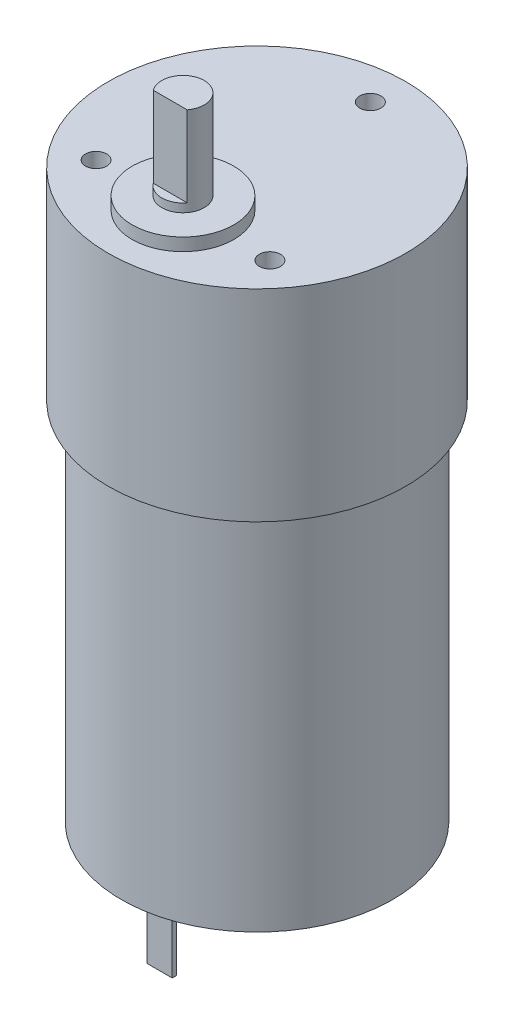
ISO-10303-21;
HEADER;
FILE_DESCRIPTION(('STEP AP214'),'2;1');
FILE_NAME('part.step','',(''),(''),'','','');
FILE_SCHEMA(('AUTOMOTIVE_DESIGN { 1 0 10303 214 1 1 1 1 }'));
ENDSEC;
DATA;
#1=APPLICATION_CONTEXT('core data for automotive mechanical design processes');
#2=APPLICATION_PROTOCOL_DEFINITION('international standard','automotive_design',2000,#1);
#3=PRODUCT_CONTEXT('',#1,'mechanical');
#4=PRODUCT('Part','Part','',(#3));
#5=PRODUCT_RELATED_PRODUCT_CATEGORY('part','',(#4));
#6=PRODUCT_DEFINITION_FORMATION('','',#4);
#7=PRODUCT_DEFINITION_CONTEXT('part definition',#1,'design');
#8=PRODUCT_DEFINITION('design','',#6,#7);
#9=PRODUCT_DEFINITION_SHAPE('','',#8);
#10=(LENGTH_UNIT() NAMED_UNIT(*) SI_UNIT(.MILLI.,.METRE.));
#11=(NAMED_UNIT(*) PLANE_ANGLE_UNIT() SI_UNIT($,.RADIAN.));
#12=(NAMED_UNIT(*) SI_UNIT($,.STERADIAN.) SOLID_ANGLE_UNIT());
#13=UNCERTAINTY_MEASURE_WITH_UNIT(LENGTH_MEASURE(1.E-05),#10,'distance_accuracy_value','');
#14=(GEOMETRIC_REPRESENTATION_CONTEXT(3) GLOBAL_UNCERTAINTY_ASSIGNED_CONTEXT((#13)) GLOBAL_UNIT_ASSIGNED_CONTEXT((#10,
#11,#12)) REPRESENTATION_CONTEXT('',''));
#15=CARTESIAN_POINT('',(0.,0.,0.));
#16=DIRECTION('',(0.,0.,1.));
#17=DIRECTION('',(1.,0.,0.));
#18=AXIS2_PLACEMENT_3D('',#15,#16,#17);
#19=CARTESIAN_POINT('',(16.,0.500000000000001,0.));
#20=DIRECTION('',(0.,-1.,0.));
#21=DIRECTION('',(0.,0.,-1.));
#22=AXIS2_PLACEMENT_3D('',#19,#20,#21);
#23=PLANE('',#22);
#24=DIRECTION('',(1.,0.,0.));
#25=VECTOR('',#24,1.);
#26=CARTESIAN_POINT('',(-1.5,0.500000000000001,11.));
#27=LINE('',#26,#25);
#28=CARTESIAN_POINT('',(-1.5,0.500000000000001,11.));
#29=VERTEX_POINT('',#28);
#30=CARTESIAN_POINT('',(1.5,0.500000000000001,11.));
#31=VERTEX_POINT('',#30);
#32=EDGE_CURVE('E150',#29,#31,#27,.T.);
#33=ORIENTED_EDGE('',*,*,#32,.F.);
#34=DIRECTION('',(0.,0.,-1.));
#35=VECTOR('',#34,1.);
#36=CARTESIAN_POINT('',(-1.5,0.500000000000001,11.5));
#37=LINE('',#36,#35);
#38=CARTESIAN_POINT('',(-1.5,0.500000000000001,11.5));
#39=VERTEX_POINT('',#38);
#40=EDGE_CURVE('E147',#39,#29,#37,.T.);
#41=ORIENTED_EDGE('',*,*,#40,.F.);
#42=DIRECTION('',(-1.,0.,0.));
#43=VECTOR('',#42,1.);
#44=CARTESIAN_POINT('',(-1.5,0.500000000000001,11.5));
#45=LINE('',#44,#43);
#46=CARTESIAN_POINT('',(1.5,0.500000000000001,11.5));
#47=VERTEX_POINT('',#46);
#48=EDGE_CURVE('E159',#47,#39,#45,.T.);
#49=ORIENTED_EDGE('',*,*,#48,.F.);
#50=DIRECTION('',(0.,0.,1.));
#51=VECTOR('',#50,1.);
#52=CARTESIAN_POINT('',(1.5,0.500000000000001,11.5));
#53=LINE('',#52,#51);
#54=EDGE_CURVE('E167',#31,#47,#53,.T.);
#55=ORIENTED_EDGE('',*,*,#54,.F.);
#56=EDGE_LOOP('',(#33,#41,#49,#55));
#57=FACE_BOUND('',#56,.T.);
#58=CARTESIAN_POINT('',(0.,0.500000000000001,0.));
#59=DIRECTION('',(0.,-1.,0.));
#60=DIRECTION('',(0.,0.,-1.));
#61=AXIS2_PLACEMENT_3D('',#58,#59,#60);
#62=CIRCLE('',#61,16.);
#63=CARTESIAN_POINT('',(0.,0.500000000000001,-16.));
#64=VERTEX_POINT('',#63);
#65=EDGE_CURVE('E227',#64,#64,#62,.T.);
#66=ORIENTED_EDGE('',*,*,#65,.T.);
#67=EDGE_LOOP('',(#66));
#68=FACE_BOUND('',#67,.T.);
#69=CARTESIAN_POINT('',(0.,0.5,0.));
#70=DIRECTION('',(0.,-1.,0.));
#71=DIRECTION('',(0.,0.,-1.));
#72=AXIS2_PLACEMENT_3D('',#69,#70,#71);
#73=CIRCLE('',#72,4.);
#74=CARTESIAN_POINT('',(0.,0.5,-4.));
#75=VERTEX_POINT('',#74);
#76=EDGE_CURVE('E230',#75,#75,#73,.T.);
#77=ORIENTED_EDGE('',*,*,#76,.F.);
#78=EDGE_LOOP('',(#77));
#79=FACE_BOUND('',#78,.T.);
#80=DIRECTION('',(-1.,0.,0.));
#81=VECTOR('',#80,1.);
#82=CARTESIAN_POINT('',(1.5,0.500000000000001,-11.));
#83=LINE('',#82,#81);
#84=CARTESIAN_POINT('',(1.5,0.500000000000001,-11.));
#85=VERTEX_POINT('',#84);
#86=CARTESIAN_POINT('',(-1.5,0.500000000000001,-11.));
#87=VERTEX_POINT('',#86);
#88=EDGE_CURVE('E530',#85,#87,#83,.T.);
#89=ORIENTED_EDGE('',*,*,#88,.F.);
#90=DIRECTION('',(0.,0.,1.));
#91=VECTOR('',#90,1.);
#92=CARTESIAN_POINT('',(1.5,0.500000000000001,-11.5));
#93=LINE('',#92,#91);
#94=CARTESIAN_POINT('',(1.5,0.500000000000001,-11.5));
#95=VERTEX_POINT('',#94);
#96=EDGE_CURVE('E145',#95,#85,#93,.T.);
#97=ORIENTED_EDGE('',*,*,#96,.F.);
#98=DIRECTION('',(1.,0.,0.));
#99=VECTOR('',#98,1.);
#100=CARTESIAN_POINT('',(1.5,0.500000000000001,-11.5));
#101=LINE('',#100,#99);
#102=CARTESIAN_POINT('',(-1.5,0.500000000000001,-11.5));
#103=VERTEX_POINT('',#102);
#104=EDGE_CURVE('E141',#103,#95,#101,.T.);
#105=ORIENTED_EDGE('',*,*,#104,.F.);
#106=DIRECTION('',(0.,0.,-1.));
#107=VECTOR('',#106,1.);
#108=CARTESIAN_POINT('',(-1.5,0.500000000000001,-11.5));
#109=LINE('',#108,#107);
#110=EDGE_CURVE('E527',#87,#103,#109,.T.);
#111=ORIENTED_EDGE('',*,*,#110,.F.);
#112=EDGE_LOOP('',(#89,#97,#105,#111));
#113=FACE_BOUND('',#112,.T.);
#114=ADVANCED_FACE('F35',(#57,#68,#79,#113),#23,.T.);
#115=CARTESIAN_POINT('',(0.,68.8,8.73));
#116=DIRECTION('',(0.,1.,0.));
#117=DIRECTION('',(0.,0.,1.));
#118=AXIS2_PLACEMENT_3D('',#115,#116,#117);
#119=PLANE('',#118);
#120=CARTESIAN_POINT('',(0.,68.8,8.73));
#121=DIRECTION('',(0.,1.,0.));
#122=DIRECTION('',(0.,0.,1.));
#123=AXIS2_PLACEMENT_3D('',#120,#121,#122);
#124=CIRCLE('',#123,6.);
#125=CARTESIAN_POINT('',(0.,68.8,14.73));
#126=VERTEX_POINT('',#125);
#127=EDGE_CURVE('E213',#126,#126,#124,.T.);
#128=ORIENTED_EDGE('',*,*,#127,.T.);
#129=EDGE_LOOP('',(#128));
#130=FACE_BOUND('',#129,.T.);
#131=CARTESIAN_POINT('',(0.,68.8,8.73));
#132=DIRECTION('',(0.,1.,0.));
#133=DIRECTION('',(0.,0.,1.));
#134=AXIS2_PLACEMENT_3D('',#131,#132,#133);
#135=CIRCLE('',#134,2.5);
#136=CARTESIAN_POINT('',(0.,68.8,11.23));
#137=VERTEX_POINT('',#136);
#138=EDGE_CURVE('E206',#137,#137,#135,.T.);
#139=ORIENTED_EDGE('',*,*,#138,.F.);
#140=EDGE_LOOP('',(#139));
#141=FACE_BOUND('',#140,.T.);
#142=ADVANCED_FACE('F250',(#130,#141),#119,.T.);
#143=CARTESIAN_POINT('',(17.55,67.3,0.));
#144=DIRECTION('',(0.,1.,0.));
#145=DIRECTION('',(0.,0.,1.));
#146=AXIS2_PLACEMENT_3D('',#143,#144,#145);
#147=PLANE('',#146);
#148=CARTESIAN_POINT('',(0.,67.3,-13.37));
#149=DIRECTION('',(0.,1.,0.));
#150=DIRECTION('',(0.,0.,1.));
#151=AXIS2_PLACEMENT_3D('',#148,#149,#150);
#152=CIRCLE('',#151,1.25);
#153=CARTESIAN_POINT('',(0.,67.3,-12.12));
#154=VERTEX_POINT('',#153);
#155=EDGE_CURVE('E187',#154,#154,#152,.T.);
#156=ORIENTED_EDGE('',*,*,#155,.F.);
#157=EDGE_LOOP('',(#156));
#158=FACE_BOUND('',#157,.T.);
#159=CARTESIAN_POINT('',(10.25,67.3,8.73));
#160=DIRECTION('',(0.,1.,0.));
#161=DIRECTION('',(0.,0.,1.));
#162=AXIS2_PLACEMENT_3D('',#159,#160,#161);
#163=CIRCLE('',#162,1.25);
#164=CARTESIAN_POINT('',(10.25,67.3,9.98));
#165=VERTEX_POINT('',#164);
#166=EDGE_CURVE('E194',#165,#165,#163,.T.);
#167=ORIENTED_EDGE('',*,*,#166,.F.);
#168=EDGE_LOOP('',(#167));
#169=FACE_BOUND('',#168,.T.);
#170=CARTESIAN_POINT('',(-10.25,67.3,8.73));
#171=DIRECTION('',(0.,1.,0.));
#172=DIRECTION('',(0.,0.,1.));
#173=AXIS2_PLACEMENT_3D('',#170,#171,#172);
#174=CIRCLE('',#173,1.25);
#175=CARTESIAN_POINT('',(-10.25,67.3,9.98));
#176=VERTEX_POINT('',#175);
#177=EDGE_CURVE('E200',#176,#176,#174,.T.);
#178=ORIENTED_EDGE('',*,*,#177,.F.);
#179=EDGE_LOOP('',(#178));
#180=FACE_BOUND('',#179,.T.);
#181=CARTESIAN_POINT('',(0.,67.3,0.));
#182=DIRECTION('',(0.,-1.,0.));
#183=DIRECTION('',(0.,0.,-1.));
#184=AXIS2_PLACEMENT_3D('',#181,#182,#183);
#185=CIRCLE('',#184,17.55);
#186=CARTESIAN_POINT('',(0.,67.3,-17.55));
#187=VERTEX_POINT('',#186);
#188=EDGE_CURVE('E216',#187,#187,#185,.T.);
#189=ORIENTED_EDGE('',*,*,#188,.F.);
#190=EDGE_LOOP('',(#189));
#191=FACE_BOUND('',#190,.T.);
#192=CARTESIAN_POINT('',(0.,67.3,8.73));
#193=DIRECTION('',(0.,1.,0.));
#194=DIRECTION('',(0.,0.,1.));
#195=AXIS2_PLACEMENT_3D('',#192,#193,#194);
#196=CIRCLE('',#195,6.);
#197=CARTESIAN_POINT('',(0.,67.3,14.73));
#198=VERTEX_POINT('',#197);
#199=EDGE_CURVE('E210',#198,#198,#196,.T.);
#200=ORIENTED_EDGE('',*,*,#199,.F.);
#201=EDGE_LOOP('',(#200));
#202=FACE_BOUND('',#201,.T.);
#203=ADVANCED_FACE('F247',(#158,#169,#180,#191,#202),#147,.T.);
#204=CARTESIAN_POINT('',(4.,0.,0.));
#205=DIRECTION('',(0.,-1.,0.));
#206=DIRECTION('',(0.,0.,-1.));
#207=AXIS2_PLACEMENT_3D('',#204,#205,#206);
#208=PLANE('',#207);
#209=CARTESIAN_POINT('',(0.,0.,0.));
#210=DIRECTION('',(0.,-1.,0.));
#211=DIRECTION('',(0.,0.,-1.));
#212=AXIS2_PLACEMENT_3D('',#209,#210,#211);
#213=CIRCLE('',#212,4.);
#214=CARTESIAN_POINT('',(0.,0.,-4.));
#215=VERTEX_POINT('',#214);
#216=EDGE_CURVE('E43',#215,#215,#213,.T.);
#217=ORIENTED_EDGE('',*,*,#216,.T.);
#218=EDGE_LOOP('',(#217));
#219=FACE_BOUND('',#218,.T.);
#220=ADVANCED_FACE('F37',(#219),#208,.T.);
#221=CARTESIAN_POINT('',(0.,0.,0.));
#222=DIRECTION('',(0.,-1.,0.));
#223=DIRECTION('',(0.,0.,-1.));
#224=AXIS2_PLACEMENT_3D('',#221,#222,#223);
#225=CYLINDRICAL_SURFACE('',#224,4.);
#226=ORIENTED_EDGE('',*,*,#76,.T.);
#227=EDGE_LOOP('',(#226));
#228=FACE_BOUND('',#227,.T.);
#229=ORIENTED_EDGE('',*,*,#216,.F.);
#230=EDGE_LOOP('',(#229));
#231=FACE_BOUND('',#230,.T.);
#232=ADVANCED_FACE('F236',(#228,#231),#225,.T.);
#233=CARTESIAN_POINT('',(0.,0.,0.));
#234=DIRECTION('',(0.,-1.,0.));
#235=DIRECTION('',(0.,0.,-1.));
#236=AXIS2_PLACEMENT_3D('',#233,#234,#235);
#237=CYLINDRICAL_SURFACE('',#236,16.);
#238=CARTESIAN_POINT('',(0.,43.5,0.));
#239=DIRECTION('',(0.,-1.,0.));
#240=DIRECTION('',(0.,0.,-1.));
#241=AXIS2_PLACEMENT_3D('',#238,#239,#240);
#242=CIRCLE('',#241,16.);
#243=CARTESIAN_POINT('',(0.,43.5,-16.));
#244=VERTEX_POINT('',#243);
#245=EDGE_CURVE('E224',#244,#244,#242,.T.);
#246=ORIENTED_EDGE('',*,*,#245,.T.);
#247=EDGE_LOOP('',(#246));
#248=FACE_BOUND('',#247,.T.);
#249=ORIENTED_EDGE('',*,*,#65,.F.);
#250=EDGE_LOOP('',(#249));
#251=FACE_BOUND('',#250,.T.);
#252=ADVANCED_FACE('F238',(#248,#251),#237,.T.);
#253=CARTESIAN_POINT('',(16.,43.5,0.));
#254=DIRECTION('',(0.,-1.,0.));
#255=DIRECTION('',(0.,0.,-1.));
#256=AXIS2_PLACEMENT_3D('',#253,#254,#255);
#257=PLANE('',#256);
#258=CARTESIAN_POINT('',(0.,43.5,0.));
#259=DIRECTION('',(0.,-1.,0.));
#260=DIRECTION('',(0.,0.,-1.));
#261=AXIS2_PLACEMENT_3D('',#258,#259,#260);
#262=CIRCLE('',#261,17.55);
#263=CARTESIAN_POINT('',(0.,43.5,-17.55));
#264=VERTEX_POINT('',#263);
#265=EDGE_CURVE('E221',#264,#264,#262,.T.);
#266=ORIENTED_EDGE('',*,*,#265,.T.);
#267=EDGE_LOOP('',(#266));
#268=FACE_BOUND('',#267,.T.);
#269=ORIENTED_EDGE('',*,*,#245,.F.);
#270=EDGE_LOOP('',(#269));
#271=FACE_BOUND('',#270,.T.);
#272=ADVANCED_FACE('F244',(#268,#271),#257,.T.);
#273=CARTESIAN_POINT('',(0.,0.,0.));
#274=DIRECTION('',(0.,-1.,0.));
#275=DIRECTION('',(0.,0.,-1.));
#276=AXIS2_PLACEMENT_3D('',#273,#274,#275);
#277=CYLINDRICAL_SURFACE('',#276,17.55);
#278=ORIENTED_EDGE('',*,*,#188,.T.);
#279=EDGE_LOOP('',(#278));
#280=FACE_BOUND('',#279,.T.);
#281=ORIENTED_EDGE('',*,*,#265,.F.);
#282=EDGE_LOOP('',(#281));
#283=FACE_BOUND('',#282,.T.);
#284=ADVANCED_FACE('F262',(#280,#283),#277,.T.);
#285=CARTESIAN_POINT('',(0.,68.8,8.73));
#286=DIRECTION('',(0.,-1.,0.));
#287=DIRECTION('',(0.,0.,-1.));
#288=AXIS2_PLACEMENT_3D('',#285,#286,#287);
#289=CYLINDRICAL_SURFACE('',#288,6.);
#290=ORIENTED_EDGE('',*,*,#127,.F.);
#291=EDGE_LOOP('',(#290));
#292=FACE_BOUND('',#291,.T.);
#293=ORIENTED_EDGE('',*,*,#199,.T.);
#294=EDGE_LOOP('',(#293));
#295=FACE_BOUND('',#294,.T.);
#296=ADVANCED_FACE('F266',(#292,#295),#289,.T.);
#297=CARTESIAN_POINT('',(0.,79.3,8.73));
#298=DIRECTION('',(0.,-1.,0.));
#299=DIRECTION('',(0.,0.,-1.));
#300=AXIS2_PLACEMENT_3D('',#297,#298,#299);
#301=CYLINDRICAL_SURFACE('',#300,2.5);
#302=CARTESIAN_POINT('',(0.,69.8,8.73));
#303=DIRECTION('',(0.,-1.,0.));
#304=DIRECTION('',(0.,0.,-1.));
#305=AXIS2_PLACEMENT_3D('',#302,#303,#304);
#306=CIRCLE('',#305,2.5);
#307=CARTESIAN_POINT('',(2.,69.8,10.23));
#308=VERTEX_POINT('',#307);
#309=CARTESIAN_POINT('',(-2.,69.8,10.23));
#310=VERTEX_POINT('',#309);
#311=EDGE_CURVE('E11',#308,#310,#306,.T.);
#312=ORIENTED_EDGE('',*,*,#311,.T.);
#313=DIRECTION('',(0.,1.,0.));
#314=VECTOR('',#313,1.);
#315=CARTESIAN_POINT('',(-2.,69.8,10.23));
#316=LINE('',#315,#314);
#317=CARTESIAN_POINT('',(-2.,79.3,10.23));
#318=VERTEX_POINT('',#317);
#319=EDGE_CURVE('E184',#310,#318,#316,.T.);
#320=ORIENTED_EDGE('',*,*,#319,.T.);
#321=CARTESIAN_POINT('',(0.,79.3,8.73));
#322=DIRECTION('',(0.,1.,0.));
#323=DIRECTION('',(0.,0.,1.));
#324=AXIS2_PLACEMENT_3D('',#321,#322,#323);
#325=CIRCLE('',#324,2.5);
#326=CARTESIAN_POINT('',(2.,79.3,10.23));
#327=VERTEX_POINT('',#326);
#328=EDGE_CURVE('E207',#327,#318,#325,.T.);
#329=ORIENTED_EDGE('',*,*,#328,.F.);
#330=DIRECTION('',(0.,1.,0.));
#331=VECTOR('',#330,1.);
#332=CARTESIAN_POINT('',(2.,69.8,10.23));
#333=LINE('',#332,#331);
#334=EDGE_CURVE('E182',#308,#327,#333,.T.);
#335=ORIENTED_EDGE('',*,*,#334,.F.);
#336=EDGE_LOOP('',(#312,#320,#329,#335));
#337=FACE_BOUND('',#336,.T.);
#338=ORIENTED_EDGE('',*,*,#138,.T.);
#339=EDGE_LOOP('',(#338));
#340=FACE_BOUND('',#339,.T.);
#341=ADVANCED_FACE('F272',(#337,#340),#301,.T.);
#342=CARTESIAN_POINT('',(0.,79.3,8.73));
#343=DIRECTION('',(0.,1.,0.));
#344=DIRECTION('',(0.,0.,1.));
#345=AXIS2_PLACEMENT_3D('',#342,#343,#344);
#346=PLANE('',#345);
#347=DIRECTION('',(-1.,0.,0.));
#348=VECTOR('',#347,1.);
#349=CARTESIAN_POINT('',(-2.,79.3,10.23));
#350=LINE('',#349,#348);
#351=EDGE_CURVE('E178',#327,#318,#350,.T.);
#352=ORIENTED_EDGE('',*,*,#351,.F.);
#353=ORIENTED_EDGE('',*,*,#328,.T.);
#354=EDGE_LOOP('',(#352,#353));
#355=FACE_BOUND('',#354,.T.);
#356=ADVANCED_FACE('F277',(#355),#346,.T.);
#357=CARTESIAN_POINT('',(-10.25,62.8,8.73));
#358=DIRECTION('',(0.,1.,0.));
#359=DIRECTION('',(0.,0.,1.));
#360=AXIS2_PLACEMENT_3D('',#357,#358,#359);
#361=CONICAL_SURFACE('',#360,1.25,1.02974425867666);
#362=CARTESIAN_POINT('',(-10.25,62.0489242262156,8.73));
#363=VERTEX_POINT('',#362);
#364=VERTEX_LOOP('',#363);
#365=FACE_BOUND('',#364,.T.);
#366=CARTESIAN_POINT('',(-10.25,62.8,8.73));
#367=DIRECTION('',(0.,1.,0.));
#368=DIRECTION('',(0.,0.,1.));
#369=AXIS2_PLACEMENT_3D('',#366,#367,#368);
#370=CIRCLE('',#369,1.25);
#371=CARTESIAN_POINT('',(-10.25,62.8,9.98));
#372=VERTEX_POINT('',#371);
#373=EDGE_CURVE('E203',#372,#372,#370,.T.);
#374=ORIENTED_EDGE('',*,*,#373,.T.);
#375=EDGE_LOOP('',(#374));
#376=FACE_BOUND('',#375,.T.);
#377=ADVANCED_FACE('F281',(#365,#376),#361,.F.);
#378=CARTESIAN_POINT('',(-10.25,67.3,8.73));
#379=DIRECTION('',(0.,1.,0.));
#380=DIRECTION('',(0.,0.,1.));
#381=AXIS2_PLACEMENT_3D('',#378,#379,#380);
#382=CYLINDRICAL_SURFACE('',#381,1.25);
#383=ORIENTED_EDGE('',*,*,#373,.F.);
#384=EDGE_LOOP('',(#383));
#385=FACE_BOUND('',#384,.T.);
#386=ORIENTED_EDGE('',*,*,#177,.T.);
#387=EDGE_LOOP('',(#386));
#388=FACE_BOUND('',#387,.T.);
#389=ADVANCED_FACE('F285',(#385,#388),#382,.F.);
#390=CARTESIAN_POINT('',(10.25,62.8,8.73));
#391=DIRECTION('',(0.,1.,0.));
#392=DIRECTION('',(0.,0.,1.));
#393=AXIS2_PLACEMENT_3D('',#390,#391,#392);
#394=CONICAL_SURFACE('',#393,1.25,1.02974425867666);
#395=CARTESIAN_POINT('',(10.25,62.0489242262156,8.73));
#396=VERTEX_POINT('',#395);
#397=VERTEX_LOOP('',#396);
#398=FACE_BOUND('',#397,.T.);
#399=CARTESIAN_POINT('',(10.25,62.8,8.73));
#400=DIRECTION('',(0.,1.,0.));
#401=DIRECTION('',(0.,0.,1.));
#402=AXIS2_PLACEMENT_3D('',#399,#400,#401);
#403=CIRCLE('',#402,1.25);
#404=CARTESIAN_POINT('',(10.25,62.8,9.98));
#405=VERTEX_POINT('',#404);
#406=EDGE_CURVE('E197',#405,#405,#403,.T.);
#407=ORIENTED_EDGE('',*,*,#406,.T.);
#408=EDGE_LOOP('',(#407));
#409=FACE_BOUND('',#408,.T.);
#410=ADVANCED_FACE('F289',(#398,#409),#394,.F.);
#411=CARTESIAN_POINT('',(10.25,67.3,8.73));
#412=DIRECTION('',(0.,1.,0.));
#413=DIRECTION('',(0.,0.,1.));
#414=AXIS2_PLACEMENT_3D('',#411,#412,#413);
#415=CYLINDRICAL_SURFACE('',#414,1.25);
#416=ORIENTED_EDGE('',*,*,#406,.F.);
#417=EDGE_LOOP('',(#416));
#418=FACE_BOUND('',#417,.T.);
#419=ORIENTED_EDGE('',*,*,#166,.T.);
#420=EDGE_LOOP('',(#419));
#421=FACE_BOUND('',#420,.T.);
#422=ADVANCED_FACE('F293',(#418,#421),#415,.F.);
#423=CARTESIAN_POINT('',(0.,62.8,-13.37));
#424=DIRECTION('',(0.,1.,0.));
#425=DIRECTION('',(0.,0.,1.));
#426=AXIS2_PLACEMENT_3D('',#423,#424,#425);
#427=CONICAL_SURFACE('',#426,1.25,1.02974425867666);
#428=CARTESIAN_POINT('',(0.,62.0489242262156,-13.37));
#429=VERTEX_POINT('',#428);
#430=VERTEX_LOOP('',#429);
#431=FACE_BOUND('',#430,.T.);
#432=CARTESIAN_POINT('',(0.,62.8,-13.37));
#433=DIRECTION('',(0.,1.,0.));
#434=DIRECTION('',(0.,0.,1.));
#435=AXIS2_PLACEMENT_3D('',#432,#433,#434);
#436=CIRCLE('',#435,1.25);
#437=CARTESIAN_POINT('',(0.,62.8,-12.12));
#438=VERTEX_POINT('',#437);
#439=EDGE_CURVE('E191',#438,#438,#436,.T.);
#440=ORIENTED_EDGE('',*,*,#439,.T.);
#441=EDGE_LOOP('',(#440));
#442=FACE_BOUND('',#441,.T.);
#443=ADVANCED_FACE('F297',(#431,#442),#427,.F.);
#444=CARTESIAN_POINT('',(0.,67.3,-13.37));
#445=DIRECTION('',(0.,1.,0.));
#446=DIRECTION('',(0.,0.,1.));
#447=AXIS2_PLACEMENT_3D('',#444,#445,#446);
#448=CYLINDRICAL_SURFACE('',#447,1.25);
#449=ORIENTED_EDGE('',*,*,#439,.F.);
#450=EDGE_LOOP('',(#449));
#451=FACE_BOUND('',#450,.T.);
#452=ORIENTED_EDGE('',*,*,#155,.T.);
#453=EDGE_LOOP('',(#452));
#454=FACE_BOUND('',#453,.T.);
#455=ADVANCED_FACE('F301',(#451,#454),#448,.F.);
#456=CARTESIAN_POINT('',(0.,69.8,0.));
#457=DIRECTION('',(0.,-1.,0.));
#458=DIRECTION('',(0.,0.,-1.));
#459=AXIS2_PLACEMENT_3D('',#456,#457,#458);
#460=PLANE('',#459);
#461=DIRECTION('',(-1.,0.,0.));
#462=VECTOR('',#461,1.);
#463=CARTESIAN_POINT('',(-2.,69.8,10.23));
#464=LINE('',#463,#462);
#465=EDGE_CURVE('E179',#308,#310,#464,.T.);
#466=ORIENTED_EDGE('',*,*,#465,.T.);
#467=ORIENTED_EDGE('',*,*,#311,.F.);
#468=EDGE_LOOP('',(#466,#467));
#469=FACE_BOUND('',#468,.T.);
#470=ADVANCED_FACE('F305',(#469),#460,.F.);
#471=CARTESIAN_POINT('',(-2.,69.8,10.23));
#472=DIRECTION('',(0.,0.,-1.));
#473=DIRECTION('',(-1.,0.,0.));
#474=AXIS2_PLACEMENT_3D('',#471,#472,#473);
#475=PLANE('',#474);
#476=ORIENTED_EDGE('',*,*,#351,.T.);
#477=ORIENTED_EDGE('',*,*,#319,.F.);
#478=ORIENTED_EDGE('',*,*,#465,.F.);
#479=ORIENTED_EDGE('',*,*,#334,.T.);
#480=EDGE_LOOP('',(#476,#477,#478,#479));
#481=FACE_BOUND('',#480,.T.);
#482=ADVANCED_FACE('F307',(#481),#475,.F.);
#483=CARTESIAN_POINT('',(-1.5,-9.,11.5));
#484=DIRECTION('',(1.,0.,0.));
#485=DIRECTION('',(0.,0.,-1.));
#486=AXIS2_PLACEMENT_3D('',#483,#484,#485);
#487=PLANE('',#486);
#488=ORIENTED_EDGE('',*,*,#40,.T.);
#489=DIRECTION('',(0.,1.,0.));
#490=VECTOR('',#489,1.);
#491=CARTESIAN_POINT('',(-1.5,-9.,11.));
#492=LINE('',#491,#490);
#493=CARTESIAN_POINT('',(-1.5,-9.,11.));
#494=VERTEX_POINT('',#493);
#495=EDGE_CURVE('E176',#494,#29,#492,.T.);
#496=ORIENTED_EDGE('',*,*,#495,.F.);
#497=DIRECTION('',(0.,0.,-1.));
#498=VECTOR('',#497,1.);
#499=CARTESIAN_POINT('',(-1.5,-9.,11.5));
#500=LINE('',#499,#498);
#501=CARTESIAN_POINT('',(-1.5,-9.,11.5));
#502=VERTEX_POINT('',#501);
#503=EDGE_CURVE('E155',#502,#494,#500,.T.);
#504=ORIENTED_EDGE('',*,*,#503,.F.);
#505=DIRECTION('',(0.,1.,0.));
#506=VECTOR('',#505,1.);
#507=CARTESIAN_POINT('',(-1.5,-9.,11.5));
#508=LINE('',#507,#506);
#509=EDGE_CURVE('E164',#502,#39,#508,.T.);
#510=ORIENTED_EDGE('',*,*,#509,.T.);
#511=EDGE_LOOP('',(#488,#496,#504,#510));
#512=FACE_BOUND('',#511,.T.);
#513=ADVANCED_FACE('F310',(#512),#487,.F.);
#514=CARTESIAN_POINT('',(-1.5,-9.,11.));
#515=DIRECTION('',(0.,0.,1.));
#516=DIRECTION('',(1.,0.,0.));
#517=AXIS2_PLACEMENT_3D('',#514,#515,#516);
#518=PLANE('',#517);
#519=ORIENTED_EDGE('',*,*,#32,.T.);
#520=DIRECTION('',(0.,1.,0.));
#521=VECTOR('',#520,1.);
#522=CARTESIAN_POINT('',(1.5,-9.,11.));
#523=LINE('',#522,#521);
#524=CARTESIAN_POINT('',(1.5,-9.,11.));
#525=VERTEX_POINT('',#524);
#526=EDGE_CURVE('E173',#525,#31,#523,.T.);
#527=ORIENTED_EDGE('',*,*,#526,.F.);
#528=DIRECTION('',(1.,0.,0.));
#529=VECTOR('',#528,1.);
#530=CARTESIAN_POINT('',(-1.5,-9.,11.));
#531=LINE('',#530,#529);
#532=EDGE_CURVE('E158',#494,#525,#531,.T.);
#533=ORIENTED_EDGE('',*,*,#532,.F.);
#534=ORIENTED_EDGE('',*,*,#495,.T.);
#535=EDGE_LOOP('',(#519,#527,#533,#534));
#536=FACE_BOUND('',#535,.T.);
#537=ADVANCED_FACE('F317',(#536),#518,.F.);
#538=CARTESIAN_POINT('',(1.5,-9.,11.5));
#539=DIRECTION('',(-1.,0.,0.));
#540=DIRECTION('',(0.,0.,1.));
#541=AXIS2_PLACEMENT_3D('',#538,#539,#540);
#542=PLANE('',#541);
#543=ORIENTED_EDGE('',*,*,#54,.T.);
#544=DIRECTION('',(0.,1.,0.));
#545=VECTOR('',#544,1.);
#546=CARTESIAN_POINT('',(1.5,-9.,11.5));
#547=LINE('',#546,#545);
#548=CARTESIAN_POINT('',(1.5,-9.,11.5));
#549=VERTEX_POINT('',#548);
#550=EDGE_CURVE('E58',#549,#47,#547,.T.);
#551=ORIENTED_EDGE('',*,*,#550,.F.);
#552=DIRECTION('',(0.,0.,1.));
#553=VECTOR('',#552,1.);
#554=CARTESIAN_POINT('',(1.5,-9.,11.5));
#555=LINE('',#554,#553);
#556=EDGE_CURVE('E161',#525,#549,#555,.T.);
#557=ORIENTED_EDGE('',*,*,#556,.F.);
#558=ORIENTED_EDGE('',*,*,#526,.T.);
#559=EDGE_LOOP('',(#543,#551,#557,#558));
#560=FACE_BOUND('',#559,.T.);
#561=ADVANCED_FACE('F321',(#560),#542,.F.);
#562=CARTESIAN_POINT('',(-1.5,-9.,11.5));
#563=DIRECTION('',(0.,0.,-1.));
#564=DIRECTION('',(-1.,0.,0.));
#565=AXIS2_PLACEMENT_3D('',#562,#563,#564);
#566=PLANE('',#565);
#567=ORIENTED_EDGE('',*,*,#48,.T.);
#568=ORIENTED_EDGE('',*,*,#509,.F.);
#569=DIRECTION('',(-1.,0.,0.));
#570=VECTOR('',#569,1.);
#571=CARTESIAN_POINT('',(-1.5,-9.,11.5));
#572=LINE('',#571,#570);
#573=EDGE_CURVE('E163',#549,#502,#572,.T.);
#574=ORIENTED_EDGE('',*,*,#573,.F.);
#575=ORIENTED_EDGE('',*,*,#550,.T.);
#576=EDGE_LOOP('',(#567,#568,#574,#575));
#577=FACE_BOUND('',#576,.T.);
#578=ADVANCED_FACE('F325',(#577),#566,.F.);
#579=CARTESIAN_POINT('',(0.,-9.,0.));
#580=DIRECTION('',(0.,-1.,0.));
#581=DIRECTION('',(0.,0.,-1.));
#582=AXIS2_PLACEMENT_3D('',#579,#580,#581);
#583=PLANE('',#582);
#584=ORIENTED_EDGE('',*,*,#503,.T.);
#585=ORIENTED_EDGE('',*,*,#532,.T.);
#586=ORIENTED_EDGE('',*,*,#556,.T.);
#587=ORIENTED_EDGE('',*,*,#573,.T.);
#588=EDGE_LOOP('',(#584,#585,#586,#587));
#589=FACE_BOUND('',#588,.T.);
#590=ADVANCED_FACE('F329',(#589),#583,.T.);
#591=CARTESIAN_POINT('',(1.5,-9.,-11.5));
#592=DIRECTION('',(-1.,0.,0.));
#593=DIRECTION('',(0.,0.,1.));
#594=AXIS2_PLACEMENT_3D('',#591,#592,#593);
#595=PLANE('',#594);
#596=ORIENTED_EDGE('',*,*,#96,.T.);
#597=DIRECTION('',(0.,1.,0.));
#598=VECTOR('',#597,1.);
#599=CARTESIAN_POINT('',(1.5,-9.,-11.));
#600=LINE('',#599,#598);
#601=CARTESIAN_POINT('',(1.5,-9.,-11.));
#602=VERTEX_POINT('',#601);
#603=EDGE_CURVE('E126',#602,#85,#600,.T.);
#604=ORIENTED_EDGE('',*,*,#603,.F.);
#605=DIRECTION('',(0.,0.,1.));
#606=VECTOR('',#605,1.);
#607=CARTESIAN_POINT('',(1.5,-9.,-11.5));
#608=LINE('',#607,#606);
#609=CARTESIAN_POINT('',(1.5,-9.,-11.5));
#610=VERTEX_POINT('',#609);
#611=EDGE_CURVE('E133',#610,#602,#608,.T.);
#612=ORIENTED_EDGE('',*,*,#611,.F.);
#613=DIRECTION('',(0.,1.,0.));
#614=VECTOR('',#613,1.);
#615=CARTESIAN_POINT('',(1.5,-9.,-11.5));
#616=LINE('',#615,#614);
#617=EDGE_CURVE('E524',#610,#95,#616,.T.);
#618=ORIENTED_EDGE('',*,*,#617,.T.);
#619=EDGE_LOOP('',(#596,#604,#612,#618));
#620=FACE_BOUND('',#619,.T.);
#621=ADVANCED_FACE('F143',(#620),#595,.F.);
#622=CARTESIAN_POINT('',(1.5,-9.,-11.));
#623=DIRECTION('',(0.,0.,-1.));
#624=DIRECTION('',(-1.,0.,0.));
#625=AXIS2_PLACEMENT_3D('',#622,#623,#624);
#626=PLANE('',#625);
#627=ORIENTED_EDGE('',*,*,#88,.T.);
#628=DIRECTION('',(0.,1.,0.));
#629=VECTOR('',#628,1.);
#630=CARTESIAN_POINT('',(-1.5,-9.,-11.));
#631=LINE('',#630,#629);
#632=CARTESIAN_POINT('',(-1.5,-9.,-11.));
#633=VERTEX_POINT('',#632);
#634=EDGE_CURVE('E129',#633,#87,#631,.T.);
#635=ORIENTED_EDGE('',*,*,#634,.F.);
#636=DIRECTION('',(-1.,0.,0.));
#637=VECTOR('',#636,1.);
#638=CARTESIAN_POINT('',(1.5,-9.,-11.));
#639=LINE('',#638,#637);
#640=EDGE_CURVE('E122',#602,#633,#639,.T.);
#641=ORIENTED_EDGE('',*,*,#640,.F.);
#642=ORIENTED_EDGE('',*,*,#603,.T.);
#643=EDGE_LOOP('',(#627,#635,#641,#642));
#644=FACE_BOUND('',#643,.T.);
#645=ADVANCED_FACE('F124',(#644),#626,.F.);
#646=CARTESIAN_POINT('',(-1.5,-9.,-11.5));
#647=DIRECTION('',(1.,0.,0.));
#648=DIRECTION('',(0.,0.,-1.));
#649=AXIS2_PLACEMENT_3D('',#646,#647,#648);
#650=PLANE('',#649);
#651=ORIENTED_EDGE('',*,*,#110,.T.);
#652=DIRECTION('',(0.,1.,0.));
#653=VECTOR('',#652,1.);
#654=CARTESIAN_POINT('',(-1.5,-9.,-11.5));
#655=LINE('',#654,#653);
#656=CARTESIAN_POINT('',(-1.5,-9.,-11.5));
#657=VERTEX_POINT('',#656);
#658=EDGE_CURVE('E50',#657,#103,#655,.T.);
#659=ORIENTED_EDGE('',*,*,#658,.F.);
#660=DIRECTION('',(0.,0.,-1.));
#661=VECTOR('',#660,1.);
#662=CARTESIAN_POINT('',(-1.5,-9.,-11.5));
#663=LINE('',#662,#661);
#664=EDGE_CURVE('E132',#633,#657,#663,.T.);
#665=ORIENTED_EDGE('',*,*,#664,.F.);
#666=ORIENTED_EDGE('',*,*,#634,.T.);
#667=EDGE_LOOP('',(#651,#659,#665,#666));
#668=FACE_BOUND('',#667,.T.);
#669=ADVANCED_FACE('F337',(#668),#650,.F.);
#670=CARTESIAN_POINT('',(1.5,-9.,-11.5));
#671=DIRECTION('',(0.,0.,1.));
#672=DIRECTION('',(1.,0.,0.));
#673=AXIS2_PLACEMENT_3D('',#670,#671,#672);
#674=PLANE('',#673);
#675=ORIENTED_EDGE('',*,*,#104,.T.);
#676=ORIENTED_EDGE('',*,*,#617,.F.);
#677=DIRECTION('',(1.,0.,0.));
#678=VECTOR('',#677,1.);
#679=CARTESIAN_POINT('',(1.5,-9.,-11.5));
#680=LINE('',#679,#678);
#681=EDGE_CURVE('E137',#657,#610,#680,.T.);
#682=ORIENTED_EDGE('',*,*,#681,.F.);
#683=ORIENTED_EDGE('',*,*,#658,.T.);
#684=EDGE_LOOP('',(#675,#676,#682,#683));
#685=FACE_BOUND('',#684,.T.);
#686=ADVANCED_FACE('F340',(#685),#674,.F.);
#687=CARTESIAN_POINT('',(0.,-9.,0.));
#688=DIRECTION('',(0.,-1.,0.));
#689=DIRECTION('',(0.,0.,-1.));
#690=AXIS2_PLACEMENT_3D('',#687,#688,#689);
#691=PLANE('',#690);
#692=ORIENTED_EDGE('',*,*,#611,.T.);
#693=ORIENTED_EDGE('',*,*,#640,.T.);
#694=ORIENTED_EDGE('',*,*,#664,.T.);
#695=ORIENTED_EDGE('',*,*,#681,.T.);
#696=EDGE_LOOP('',(#692,#693,#694,#695));
#697=FACE_BOUND('',#696,.T.);
#698=ADVANCED_FACE('F136',(#697),#691,.T.);
#699=CLOSED_SHELL('',(#114,#142,#203,#220,#232,#252,#272,#284,#296,#341,#356,#377,#389,#410,
#422,#443,#455,#470,#482,#513,#537,#561,#578,#590,#621,#645,#669,#686,#698));
#700=MANIFOLD_SOLID_BREP('B2',#699);
#701=ADVANCED_BREP_SHAPE_REPRESENTATION('',(#18,#700),#14);
#702=SHAPE_DEFINITION_REPRESENTATION(#9,#701);
ENDSEC;
END-ISO-10303-21;
